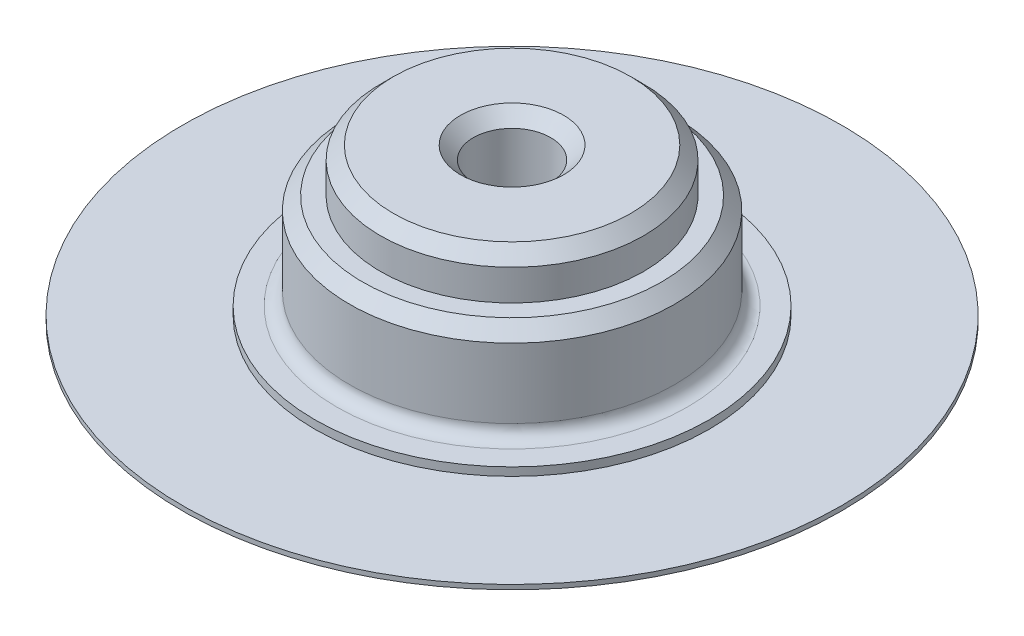
ISO-10303-21;
HEADER;
FILE_DESCRIPTION(('STEP AP214'),'2;1');
FILE_NAME('part.step','',(''),(''),'','','');
FILE_SCHEMA(('AUTOMOTIVE_DESIGN { 1 0 10303 214 1 1 1 1 }'));
ENDSEC;
DATA;
#1=APPLICATION_CONTEXT('core data for automotive mechanical design processes');
#2=APPLICATION_PROTOCOL_DEFINITION('international standard','automotive_design',2000,#1);
#3=PRODUCT_CONTEXT('',#1,'mechanical');
#4=PRODUCT('Part','Part','',(#3));
#5=PRODUCT_RELATED_PRODUCT_CATEGORY('part','',(#4));
#6=PRODUCT_DEFINITION_FORMATION('','',#4);
#7=PRODUCT_DEFINITION_CONTEXT('part definition',#1,'design');
#8=PRODUCT_DEFINITION('design','',#6,#7);
#9=PRODUCT_DEFINITION_SHAPE('','',#8);
#10=(LENGTH_UNIT() NAMED_UNIT(*) SI_UNIT(.MILLI.,.METRE.));
#11=(NAMED_UNIT(*) PLANE_ANGLE_UNIT() SI_UNIT($,.RADIAN.));
#12=(NAMED_UNIT(*) SI_UNIT($,.STERADIAN.) SOLID_ANGLE_UNIT());
#13=UNCERTAINTY_MEASURE_WITH_UNIT(LENGTH_MEASURE(1.E-05),#10,'distance_accuracy_value','');
#14=(GEOMETRIC_REPRESENTATION_CONTEXT(3) GLOBAL_UNCERTAINTY_ASSIGNED_CONTEXT((#13)) GLOBAL_UNIT_ASSIGNED_CONTEXT((#10,
#11,#12)) REPRESENTATION_CONTEXT('',''));
#15=CARTESIAN_POINT('',(0.,0.,0.));
#16=DIRECTION('',(0.,0.,1.));
#17=DIRECTION('',(1.,0.,0.));
#18=AXIS2_PLACEMENT_3D('',#15,#16,#17);
#19=CARTESIAN_POINT('',(0.,0.,0.));
#20=DIRECTION('',(0.,-1.,0.));
#21=DIRECTION('',(1.,0.,0.));
#22=AXIS2_PLACEMENT_3D('',#19,#20,#21);
#23=CYLINDRICAL_SURFACE('',#22,12.78);
#24=CARTESIAN_POINT('',(0.,0.179999999999999,0.));
#25=DIRECTION('',(0.,-1.,0.));
#26=DIRECTION('',(1.,0.,0.));
#27=AXIS2_PLACEMENT_3D('',#24,#25,#26);
#28=CIRCLE('',#27,12.78);
#29=CARTESIAN_POINT('',(12.78,0.179999999999997,0.));
#30=VERTEX_POINT('',#29);
#31=EDGE_CURVE('E78',#30,#30,#28,.T.);
#32=ORIENTED_EDGE('',*,*,#31,.T.);
#33=EDGE_LOOP('',(#32));
#34=FACE_BOUND('',#33,.T.);
#35=CARTESIAN_POINT('',(0.,0.,0.));
#36=DIRECTION('',(0.,-1.,0.));
#37=DIRECTION('',(1.,0.,0.));
#38=AXIS2_PLACEMENT_3D('',#35,#36,#37);
#39=CIRCLE('',#38,12.78);
#40=CARTESIAN_POINT('',(12.78,0.,0.));
#41=VERTEX_POINT('',#40);
#42=EDGE_CURVE('E10',#41,#41,#39,.T.);
#43=ORIENTED_EDGE('',*,*,#42,.F.);
#44=EDGE_LOOP('',(#43));
#45=FACE_BOUND('',#44,.T.);
#46=ADVANCED_FACE('F32',(#34,#45),#23,.T.);
#47=CARTESIAN_POINT('',(-1.50000000000001,0.,0.));
#48=DIRECTION('',(0.,-1.,0.));
#49=DIRECTION('',(1.,0.,0.));
#50=AXIS2_PLACEMENT_3D('',#47,#48,#49);
#51=PLANE('',#50);
#52=ORIENTED_EDGE('',*,*,#42,.T.);
#53=EDGE_LOOP('',(#52));
#54=FACE_BOUND('',#53,.T.);
#55=CARTESIAN_POINT('',(0.,0.,0.));
#56=DIRECTION('',(0.,-1.,0.));
#57=DIRECTION('',(1.,0.,0.));
#58=AXIS2_PLACEMENT_3D('',#55,#56,#57);
#59=CIRCLE('',#58,1.50000000000001);
#60=CARTESIAN_POINT('',(1.50000000000001,0.,0.));
#61=VERTEX_POINT('',#60);
#62=EDGE_CURVE('E38',#61,#61,#59,.T.);
#63=ORIENTED_EDGE('',*,*,#62,.F.);
#64=EDGE_LOOP('',(#63));
#65=FACE_BOUND('',#64,.T.);
#66=ADVANCED_FACE('F96',(#54,#65),#51,.T.);
#67=CARTESIAN_POINT('',(0.,0.,0.));
#68=DIRECTION('',(0.,-1.,0.));
#69=DIRECTION('',(1.,0.,0.));
#70=AXIS2_PLACEMENT_3D('',#67,#68,#69);
#71=CYLINDRICAL_SURFACE('',#70,1.5);
#72=ORIENTED_EDGE('',*,*,#62,.T.);
#73=EDGE_LOOP('',(#72));
#74=FACE_BOUND('',#73,.T.);
#75=CARTESIAN_POINT('',(0.,5.39999999999999,0.));
#76=DIRECTION('',(0.,-1.,0.));
#77=DIRECTION('',(1.,0.,0.));
#78=AXIS2_PLACEMENT_3D('',#75,#76,#77);
#79=CIRCLE('',#78,1.5);
#80=CARTESIAN_POINT('',(1.5,5.39999999999999,0.));
#81=VERTEX_POINT('',#80);
#82=EDGE_CURVE('E42',#81,#81,#79,.T.);
#83=ORIENTED_EDGE('',*,*,#82,.F.);
#84=EDGE_LOOP('',(#83));
#85=FACE_BOUND('',#84,.T.);
#86=ADVANCED_FACE('F100',(#74,#85),#71,.F.);
#87=CARTESIAN_POINT('',(0.,5.9,0.));
#88=DIRECTION('',(0.,1.,0.));
#89=DIRECTION('',(-1.,0.,0.));
#90=AXIS2_PLACEMENT_3D('',#87,#88,#89);
#91=CONICAL_SURFACE('',#90,2.,0.785398163397438);
#92=ORIENTED_EDGE('',*,*,#82,.T.);
#93=EDGE_LOOP('',(#92));
#94=FACE_BOUND('',#93,.T.);
#95=CARTESIAN_POINT('',(0.,5.9,0.));
#96=DIRECTION('',(0.,-1.,0.));
#97=DIRECTION('',(1.,0.,0.));
#98=AXIS2_PLACEMENT_3D('',#95,#96,#97);
#99=CIRCLE('',#98,2.);
#100=CARTESIAN_POINT('',(2.,5.9,0.));
#101=VERTEX_POINT('',#100);
#102=EDGE_CURVE('E46',#101,#101,#99,.T.);
#103=ORIENTED_EDGE('',*,*,#102,.F.);
#104=EDGE_LOOP('',(#103));
#105=FACE_BOUND('',#104,.T.);
#106=ADVANCED_FACE('F104',(#94,#105),#91,.F.);
#107=CARTESIAN_POINT('',(-4.6,5.9,0.));
#108=DIRECTION('',(0.,1.,0.));
#109=DIRECTION('',(-1.,0.,0.));
#110=AXIS2_PLACEMENT_3D('',#107,#108,#109);
#111=PLANE('',#110);
#112=ORIENTED_EDGE('',*,*,#102,.T.);
#113=EDGE_LOOP('',(#112));
#114=FACE_BOUND('',#113,.T.);
#115=CARTESIAN_POINT('',(0.,5.9,0.));
#116=DIRECTION('',(0.,-1.,0.));
#117=DIRECTION('',(1.,0.,0.));
#118=AXIS2_PLACEMENT_3D('',#115,#116,#117);
#119=CIRCLE('',#118,4.6);
#120=CARTESIAN_POINT('',(4.6,5.9,0.));
#121=VERTEX_POINT('',#120);
#122=EDGE_CURVE('E51',#121,#121,#119,.T.);
#123=ORIENTED_EDGE('',*,*,#122,.F.);
#124=EDGE_LOOP('',(#123));
#125=FACE_BOUND('',#124,.T.);
#126=ADVANCED_FACE('F110',(#114,#125),#111,.T.);
#127=CARTESIAN_POINT('',(0.,5.39999999999999,0.));
#128=DIRECTION('',(0.,-1.,0.));
#129=DIRECTION('',(1.,0.,0.));
#130=AXIS2_PLACEMENT_3D('',#127,#128,#129);
#131=CONICAL_SURFACE('',#130,5.1,0.785398163397438);
#132=ORIENTED_EDGE('',*,*,#122,.T.);
#133=EDGE_LOOP('',(#132));
#134=FACE_BOUND('',#133,.T.);
#135=CARTESIAN_POINT('',(0.,5.39999999999999,0.));
#136=DIRECTION('',(0.,-1.,0.));
#137=DIRECTION('',(1.,0.,0.));
#138=AXIS2_PLACEMENT_3D('',#135,#136,#137);
#139=CIRCLE('',#138,5.1);
#140=CARTESIAN_POINT('',(5.1,5.39999999999999,0.));
#141=VERTEX_POINT('',#140);
#142=EDGE_CURVE('E54',#141,#141,#139,.T.);
#143=ORIENTED_EDGE('',*,*,#142,.F.);
#144=EDGE_LOOP('',(#143));
#145=FACE_BOUND('',#144,.T.);
#146=ADVANCED_FACE('F114',(#134,#145),#131,.T.);
#147=CARTESIAN_POINT('',(0.,0.,0.));
#148=DIRECTION('',(0.,-1.,0.));
#149=DIRECTION('',(1.,0.,0.));
#150=AXIS2_PLACEMENT_3D('',#147,#148,#149);
#151=CYLINDRICAL_SURFACE('',#150,5.1);
#152=ORIENTED_EDGE('',*,*,#142,.T.);
#153=EDGE_LOOP('',(#152));
#154=FACE_BOUND('',#153,.T.);
#155=CARTESIAN_POINT('',(0.,4.2,0.));
#156=DIRECTION('',(0.,-1.,0.));
#157=DIRECTION('',(1.,0.,0.));
#158=AXIS2_PLACEMENT_3D('',#155,#156,#157);
#159=CIRCLE('',#158,5.1);
#160=CARTESIAN_POINT('',(5.1,4.2,0.));
#161=VERTEX_POINT('',#160);
#162=EDGE_CURVE('E57',#161,#161,#159,.T.);
#163=ORIENTED_EDGE('',*,*,#162,.F.);
#164=EDGE_LOOP('',(#163));
#165=FACE_BOUND('',#164,.T.);
#166=ADVANCED_FACE('F118',(#154,#165),#151,.T.);
#167=CARTESIAN_POINT('',(-5.8,4.2,0.));
#168=DIRECTION('',(0.,1.,0.));
#169=DIRECTION('',(-1.,0.,0.));
#170=AXIS2_PLACEMENT_3D('',#167,#168,#169);
#171=PLANE('',#170);
#172=ORIENTED_EDGE('',*,*,#162,.T.);
#173=EDGE_LOOP('',(#172));
#174=FACE_BOUND('',#173,.T.);
#175=CARTESIAN_POINT('',(0.,4.20000000000001,0.));
#176=DIRECTION('',(0.,-1.,0.));
#177=DIRECTION('',(1.,0.,0.));
#178=AXIS2_PLACEMENT_3D('',#175,#176,#177);
#179=CIRCLE('',#178,5.8);
#180=CARTESIAN_POINT('',(5.8,4.20000000000001,0.));
#181=VERTEX_POINT('',#180);
#182=EDGE_CURVE('E60',#181,#181,#179,.T.);
#183=ORIENTED_EDGE('',*,*,#182,.F.);
#184=EDGE_LOOP('',(#183));
#185=FACE_BOUND('',#184,.T.);
#186=ADVANCED_FACE('F122',(#174,#185),#171,.T.);
#187=CARTESIAN_POINT('',(0.,3.7,0.));
#188=DIRECTION('',(0.,-1.,0.));
#189=DIRECTION('',(1.,0.,0.));
#190=AXIS2_PLACEMENT_3D('',#187,#188,#189);
#191=CONICAL_SURFACE('',#190,6.3,0.785398163397442);
#192=ORIENTED_EDGE('',*,*,#182,.T.);
#193=EDGE_LOOP('',(#192));
#194=FACE_BOUND('',#193,.T.);
#195=CARTESIAN_POINT('',(0.,3.7,0.));
#196=DIRECTION('',(0.,-1.,0.));
#197=DIRECTION('',(1.,0.,0.));
#198=AXIS2_PLACEMENT_3D('',#195,#196,#197);
#199=CIRCLE('',#198,6.3);
#200=CARTESIAN_POINT('',(6.3,3.7,0.));
#201=VERTEX_POINT('',#200);
#202=EDGE_CURVE('E63',#201,#201,#199,.T.);
#203=ORIENTED_EDGE('',*,*,#202,.F.);
#204=EDGE_LOOP('',(#203));
#205=FACE_BOUND('',#204,.T.);
#206=ADVANCED_FACE('F126',(#194,#205),#191,.T.);
#207=CARTESIAN_POINT('',(0.,0.,0.));
#208=DIRECTION('',(0.,-1.,0.));
#209=DIRECTION('',(1.,0.,0.));
#210=AXIS2_PLACEMENT_3D('',#207,#208,#209);
#211=CYLINDRICAL_SURFACE('',#210,6.3);
#212=ORIENTED_EDGE('',*,*,#202,.T.);
#213=EDGE_LOOP('',(#212));
#214=FACE_BOUND('',#213,.T.);
#215=CARTESIAN_POINT('',(0.,0.999999999999996,0.));
#216=DIRECTION('',(0.,-1.,0.));
#217=DIRECTION('',(1.,0.,0.));
#218=AXIS2_PLACEMENT_3D('',#215,#216,#217);
#219=CIRCLE('',#218,6.3);
#220=CARTESIAN_POINT('',(6.3,0.999999999999995,0.));
#221=VERTEX_POINT('',#220);
#222=EDGE_CURVE('E66',#221,#221,#219,.T.);
#223=ORIENTED_EDGE('',*,*,#222,.F.);
#224=EDGE_LOOP('',(#223));
#225=FACE_BOUND('',#224,.T.);
#226=ADVANCED_FACE('F130',(#214,#225),#211,.T.);
#227=CARTESIAN_POINT('',(0.,0.999999999999998,0.));
#228=DIRECTION('',(0.,-1.,0.));
#229=DIRECTION('',(1.,0.,0.));
#230=AXIS2_PLACEMENT_3D('',#227,#228,#229);
#231=TOROIDAL_SURFACE('',#230,6.8,0.499999999999999);
#232=ORIENTED_EDGE('',*,*,#222,.T.);
#233=EDGE_LOOP('',(#232));
#234=FACE_BOUND('',#233,.T.);
#235=CARTESIAN_POINT('',(0.,0.499999999999999,0.));
#236=DIRECTION('',(0.,-1.,0.));
#237=DIRECTION('',(1.,0.,0.));
#238=AXIS2_PLACEMENT_3D('',#235,#236,#237);
#239=CIRCLE('',#238,6.8);
#240=CARTESIAN_POINT('',(6.8,0.499999999999998,0.));
#241=VERTEX_POINT('',#240);
#242=EDGE_CURVE('E69',#241,#241,#239,.T.);
#243=ORIENTED_EDGE('',*,*,#242,.F.);
#244=EDGE_LOOP('',(#243));
#245=FACE_BOUND('',#244,.T.);
#246=ADVANCED_FACE('F134',(#234,#245),#231,.F.);
#247=CARTESIAN_POINT('',(-7.65,0.5,0.));
#248=DIRECTION('',(0.,1.,0.));
#249=DIRECTION('',(-1.,0.,0.));
#250=AXIS2_PLACEMENT_3D('',#247,#248,#249);
#251=PLANE('',#250);
#252=ORIENTED_EDGE('',*,*,#242,.T.);
#253=EDGE_LOOP('',(#252));
#254=FACE_BOUND('',#253,.T.);
#255=CARTESIAN_POINT('',(0.,0.499999999999999,0.));
#256=DIRECTION('',(0.,-1.,0.));
#257=DIRECTION('',(1.,0.,0.));
#258=AXIS2_PLACEMENT_3D('',#255,#256,#257);
#259=CIRCLE('',#258,7.65);
#260=CARTESIAN_POINT('',(7.65,0.499999999999998,0.));
#261=VERTEX_POINT('',#260);
#262=EDGE_CURVE('E72',#261,#261,#259,.T.);
#263=ORIENTED_EDGE('',*,*,#262,.F.);
#264=EDGE_LOOP('',(#263));
#265=FACE_BOUND('',#264,.T.);
#266=ADVANCED_FACE('F92',(#254,#265),#251,.T.);
#267=CARTESIAN_POINT('',(0.,0.,0.));
#268=DIRECTION('',(0.,-1.,0.));
#269=DIRECTION('',(1.,0.,0.));
#270=AXIS2_PLACEMENT_3D('',#267,#268,#269);
#271=CYLINDRICAL_SURFACE('',#270,7.65);
#272=ORIENTED_EDGE('',*,*,#262,.T.);
#273=EDGE_LOOP('',(#272));
#274=FACE_BOUND('',#273,.T.);
#275=CARTESIAN_POINT('',(0.,0.179999999999999,0.));
#276=DIRECTION('',(0.,-1.,0.));
#277=DIRECTION('',(1.,0.,0.));
#278=AXIS2_PLACEMENT_3D('',#275,#276,#277);
#279=CIRCLE('',#278,7.65);
#280=CARTESIAN_POINT('',(7.65,0.179999999999998,0.));
#281=VERTEX_POINT('',#280);
#282=EDGE_CURVE('E75',#281,#281,#279,.T.);
#283=ORIENTED_EDGE('',*,*,#282,.F.);
#284=EDGE_LOOP('',(#283));
#285=FACE_BOUND('',#284,.T.);
#286=ADVANCED_FACE('F86',(#274,#285),#271,.T.);
#287=CARTESIAN_POINT('',(-12.78,0.180000000000001,0.));
#288=DIRECTION('',(0.,1.,0.));
#289=DIRECTION('',(-1.,0.,0.));
#290=AXIS2_PLACEMENT_3D('',#287,#288,#289);
#291=PLANE('',#290);
#292=ORIENTED_EDGE('',*,*,#282,.T.);
#293=EDGE_LOOP('',(#292));
#294=FACE_BOUND('',#293,.T.);
#295=ORIENTED_EDGE('',*,*,#31,.F.);
#296=EDGE_LOOP('',(#295));
#297=FACE_BOUND('',#296,.T.);
#298=ADVANCED_FACE('F84',(#294,#297),#291,.T.);
#299=CLOSED_SHELL('',(#46,#66,#86,#106,#126,#146,#166,#186,#206,#226,#246,#266,#286,#298));
#300=MANIFOLD_SOLID_BREP('B2',#299);
#301=ADVANCED_BREP_SHAPE_REPRESENTATION('',(#18,#300),#14);
#302=SHAPE_DEFINITION_REPRESENTATION(#9,#301);
ENDSEC;
END-ISO-10303-21;
